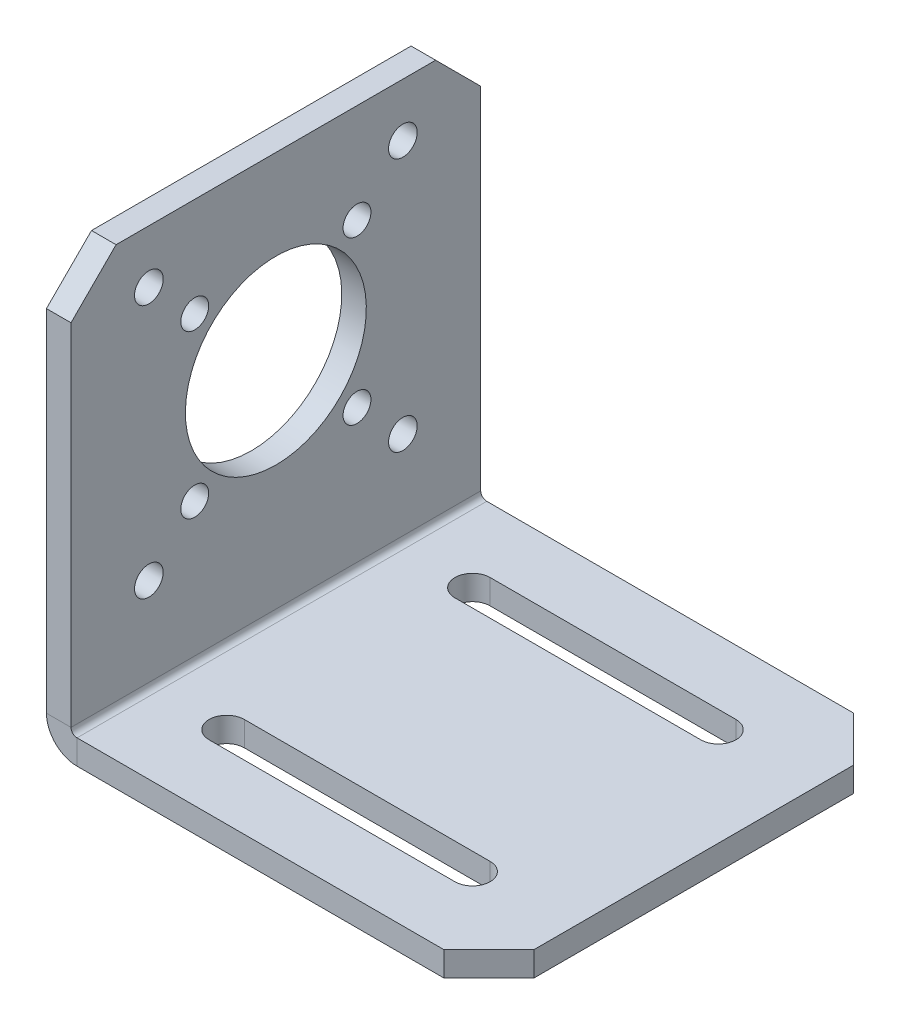
ISO-10303-21;
HEADER;
FILE_DESCRIPTION(('STEP AP214'),'2;1');
FILE_NAME('part.step','',(''),(''),'','','');
FILE_SCHEMA(('AUTOMOTIVE_DESIGN { 1 0 10303 214 1 1 1 1 }'));
ENDSEC;
DATA;
#1=APPLICATION_CONTEXT('core data for automotive mechanical design processes');
#2=APPLICATION_PROTOCOL_DEFINITION('international standard','automotive_design',2000,#1);
#3=PRODUCT_CONTEXT('',#1,'mechanical');
#4=PRODUCT('Part','Part','',(#3));
#5=PRODUCT_RELATED_PRODUCT_CATEGORY('part','',(#4));
#6=PRODUCT_DEFINITION_FORMATION('','',#4);
#7=PRODUCT_DEFINITION_CONTEXT('part definition',#1,'design');
#8=PRODUCT_DEFINITION('design','',#6,#7);
#9=PRODUCT_DEFINITION_SHAPE('','',#8);
#10=(LENGTH_UNIT() NAMED_UNIT(*) SI_UNIT(.MILLI.,.METRE.));
#11=(NAMED_UNIT(*) PLANE_ANGLE_UNIT() SI_UNIT($,.RADIAN.));
#12=(NAMED_UNIT(*) SI_UNIT($,.STERADIAN.) SOLID_ANGLE_UNIT());
#13=UNCERTAINTY_MEASURE_WITH_UNIT(LENGTH_MEASURE(1.E-05),#10,'distance_accuracy_value','');
#14=(GEOMETRIC_REPRESENTATION_CONTEXT(3) GLOBAL_UNCERTAINTY_ASSIGNED_CONTEXT((#13)) GLOBAL_UNIT_ASSIGNED_CONTEXT((#10,
#11,#12)) REPRESENTATION_CONTEXT('',''));
#15=CARTESIAN_POINT('',(0.,0.,0.));
#16=DIRECTION('',(0.,0.,1.));
#17=DIRECTION('',(1.,0.,0.));
#18=AXIS2_PLACEMENT_3D('',#15,#16,#17);
#19=CARTESIAN_POINT('',(3.7366,0.,-50.));
#20=DIRECTION('',(0.,0.,-1.));
#21=DIRECTION('',(-1.,0.,0.));
#22=AXIS2_PLACEMENT_3D('',#19,#20,#21);
#23=PLANE('',#22);
#24=DIRECTION('',(0.,1.,0.));
#25=VECTOR('',#24,1.);
#26=CARTESIAN_POINT('',(3.7366,0.,-50.));
#27=LINE('',#26,#25);
#28=CARTESIAN_POINT('',(3.7366,0.,-50.));
#29=VERTEX_POINT('',#28);
#30=CARTESIAN_POINT('',(3.7366,3.,-50.));
#31=VERTEX_POINT('',#30);
#32=EDGE_CURVE('E345',#29,#31,#27,.T.);
#33=ORIENTED_EDGE('',*,*,#32,.F.);
#34=CARTESIAN_POINT('',(3.7366,3.73660000000001,-50.));
#35=DIRECTION('',(0.,0.,-1.));
#36=DIRECTION('',(-1.,0.,0.));
#37=AXIS2_PLACEMENT_3D('',#34,#35,#36);
#38=CIRCLE('',#37,3.7366);
#39=CARTESIAN_POINT('',(0.,3.73660000000003,-50.));
#40=VERTEX_POINT('',#39);
#41=EDGE_CURVE('E291',#40,#29,#38,.F.);
#42=ORIENTED_EDGE('',*,*,#41,.F.);
#43=DIRECTION('',(-1.,0.,0.));
#44=VECTOR('',#43,1.);
#45=CARTESIAN_POINT('',(3.,3.73660000000001,-50.));
#46=LINE('',#45,#44);
#47=CARTESIAN_POINT('',(3.,3.73660000000001,-50.));
#48=VERTEX_POINT('',#47);
#49=EDGE_CURVE('E342',#48,#40,#46,.T.);
#50=ORIENTED_EDGE('',*,*,#49,.F.);
#51=CARTESIAN_POINT('',(3.7366,3.73660000000001,-50.));
#52=DIRECTION('',(0.,0.,-1.));
#53=DIRECTION('',(-1.,0.,0.));
#54=AXIS2_PLACEMENT_3D('',#51,#52,#53);
#55=CIRCLE('',#54,0.7366);
#56=EDGE_CURVE('E298',#48,#31,#55,.F.);
#57=ORIENTED_EDGE('',*,*,#56,.T.);
#58=EDGE_LOOP('',(#33,#42,#50,#57));
#59=FACE_BOUND('',#58,.T.);
#60=ADVANCED_FACE('F40',(#59),#23,.T.);
#61=CARTESIAN_POINT('',(3.,3.73660000000001,-50.));
#62=DIRECTION('',(0.,0.,-1.));
#63=DIRECTION('',(-1.,0.,0.));
#64=AXIS2_PLACEMENT_3D('',#61,#62,#63);
#65=PLANE('',#64);
#66=DIRECTION('',(1.,0.,0.));
#67=VECTOR('',#66,1.);
#68=CARTESIAN_POINT('',(0.,3.,-50.));
#69=LINE('',#68,#67);
#70=CARTESIAN_POINT('',(48.5,2.99999999999999,-50.));
#71=VERTEX_POINT('',#70);
#72=EDGE_CURVE('E286',#31,#71,#69,.T.);
#73=ORIENTED_EDGE('',*,*,#72,.T.);
#74=DIRECTION('',(0.,-1.,0.));
#75=VECTOR('',#74,1.);
#76=CARTESIAN_POINT('',(48.5,3.73660000000001,-50.));
#77=LINE('',#76,#75);
#78=CARTESIAN_POINT('',(48.5,0.,-50.));
#79=VERTEX_POINT('',#78);
#80=EDGE_CURVE('E63',#71,#79,#77,.T.);
#81=ORIENTED_EDGE('',*,*,#80,.T.);
#82=DIRECTION('',(1.,0.,0.));
#83=VECTOR('',#82,1.);
#84=CARTESIAN_POINT('',(0.,0.,-50.));
#85=LINE('',#84,#83);
#86=EDGE_CURVE('E288',#29,#79,#85,.T.);
#87=ORIENTED_EDGE('',*,*,#86,.F.);
#88=ORIENTED_EDGE('',*,*,#32,.T.);
#89=EDGE_LOOP('',(#73,#81,#87,#88));
#90=FACE_BOUND('',#89,.T.);
#91=ADVANCED_FACE('F412',(#90),#65,.T.);
#92=CARTESIAN_POINT('',(0.,3.73660000000003,0.));
#93=DIRECTION('',(0.,0.,1.));
#94=DIRECTION('',(1.,0.,0.));
#95=AXIS2_PLACEMENT_3D('',#92,#93,#94);
#96=PLANE('',#95);
#97=DIRECTION('',(1.,0.,0.));
#98=VECTOR('',#97,1.);
#99=CARTESIAN_POINT('',(0.,3.73660000000003,0.));
#100=LINE('',#99,#98);
#101=CARTESIAN_POINT('',(0.,3.73660000000003,0.));
#102=VERTEX_POINT('',#101);
#103=CARTESIAN_POINT('',(3.,3.73660000000001,0.));
#104=VERTEX_POINT('',#103);
#105=EDGE_CURVE('E339',#102,#104,#100,.T.);
#106=ORIENTED_EDGE('',*,*,#105,.F.);
#107=CARTESIAN_POINT('',(3.7366,3.73660000000001,0.));
#108=DIRECTION('',(0.,0.,-1.));
#109=DIRECTION('',(-1.,0.,0.));
#110=AXIS2_PLACEMENT_3D('',#107,#108,#109);
#111=CIRCLE('',#110,3.7366);
#112=CARTESIAN_POINT('',(3.7366,0.,0.));
#113=VERTEX_POINT('',#112);
#114=EDGE_CURVE('E306',#102,#113,#111,.F.);
#115=ORIENTED_EDGE('',*,*,#114,.T.);
#116=DIRECTION('',(0.,-1.,0.));
#117=VECTOR('',#116,1.);
#118=CARTESIAN_POINT('',(3.7366,3.,0.));
#119=LINE('',#118,#117);
#120=CARTESIAN_POINT('',(3.7366,3.,0.));
#121=VERTEX_POINT('',#120);
#122=EDGE_CURVE('E337',#121,#113,#119,.T.);
#123=ORIENTED_EDGE('',*,*,#122,.F.);
#124=CARTESIAN_POINT('',(3.7366,3.73660000000001,0.));
#125=DIRECTION('',(0.,0.,-1.));
#126=DIRECTION('',(-1.,0.,0.));
#127=AXIS2_PLACEMENT_3D('',#124,#125,#126);
#128=CIRCLE('',#127,0.7366);
#129=EDGE_CURVE('E289',#104,#121,#128,.F.);
#130=ORIENTED_EDGE('',*,*,#129,.F.);
#131=EDGE_LOOP('',(#106,#115,#123,#130));
#132=FACE_BOUND('',#131,.T.);
#133=ADVANCED_FACE('F392',(#132),#96,.T.);
#134=CARTESIAN_POINT('',(3.7366,3.,0.));
#135=DIRECTION('',(0.,0.,1.));
#136=DIRECTION('',(1.,0.,0.));
#137=AXIS2_PLACEMENT_3D('',#134,#135,#136);
#138=PLANE('',#137);
#139=DIRECTION('',(0.,-1.,0.));
#140=VECTOR('',#139,1.);
#141=CARTESIAN_POINT('',(3.,52.,0.));
#142=LINE('',#141,#140);
#143=CARTESIAN_POINT('',(3.,46.5,0.));
#144=VERTEX_POINT('',#143);
#145=EDGE_CURVE('E311',#144,#104,#142,.T.);
#146=ORIENTED_EDGE('',*,*,#145,.F.);
#147=DIRECTION('',(-1.,0.,0.));
#148=VECTOR('',#147,1.);
#149=CARTESIAN_POINT('',(3.7366,46.5,0.));
#150=LINE('',#149,#148);
#151=CARTESIAN_POINT('',(0.,46.5,0.));
#152=VERTEX_POINT('',#151);
#153=EDGE_CURVE('E11',#144,#152,#150,.T.);
#154=ORIENTED_EDGE('',*,*,#153,.T.);
#155=DIRECTION('',(0.,-1.,0.));
#156=VECTOR('',#155,1.);
#157=CARTESIAN_POINT('',(0.,52.,0.));
#158=LINE('',#157,#156);
#159=EDGE_CURVE('E309',#152,#102,#158,.T.);
#160=ORIENTED_EDGE('',*,*,#159,.T.);
#161=ORIENTED_EDGE('',*,*,#105,.T.);
#162=EDGE_LOOP('',(#146,#154,#160,#161));
#163=FACE_BOUND('',#162,.T.);
#164=ADVANCED_FACE('F449',(#163),#138,.T.);
#165=CARTESIAN_POINT('',(0.,3.,-50.));
#166=DIRECTION('',(0.,-1.,0.));
#167=DIRECTION('',(1.,0.,0.));
#168=AXIS2_PLACEMENT_3D('',#165,#166,#167);
#169=PLANE('',#168);
#170=DIRECTION('',(1.,0.,0.));
#171=VECTOR('',#170,1.);
#172=CARTESIAN_POINT('',(12.,3.,-37.85));
#173=LINE('',#172,#171);
#174=CARTESIAN_POINT('',(12.,3.,-37.85));
#175=VERTEX_POINT('',#174);
#176=CARTESIAN_POINT('',(42.,2.99999999999999,-37.85));
#177=VERTEX_POINT('',#176);
#178=EDGE_CURVE('E208',#175,#177,#173,.T.);
#179=ORIENTED_EDGE('',*,*,#178,.F.);
#180=CARTESIAN_POINT('',(12.,3.,-40.));
#181=DIRECTION('',(0.,1.,0.));
#182=DIRECTION('',(-1.,0.,0.));
#183=AXIS2_PLACEMENT_3D('',#180,#181,#182);
#184=CIRCLE('',#183,2.14999999999999);
#185=CARTESIAN_POINT('',(12.,3.,-42.15));
#186=VERTEX_POINT('',#185);
#187=EDGE_CURVE('E200',#186,#175,#184,.T.);
#188=ORIENTED_EDGE('',*,*,#187,.F.);
#189=DIRECTION('',(-1.,0.,0.));
#190=VECTOR('',#189,1.);
#191=CARTESIAN_POINT('',(12.,3.,-42.15));
#192=LINE('',#191,#190);
#193=CARTESIAN_POINT('',(42.,2.99999999999999,-42.15));
#194=VERTEX_POINT('',#193);
#195=EDGE_CURVE('E201',#194,#186,#192,.T.);
#196=ORIENTED_EDGE('',*,*,#195,.F.);
#197=CARTESIAN_POINT('',(42.,2.99999999999999,-40.));
#198=DIRECTION('',(0.,1.,0.));
#199=DIRECTION('',(-1.,0.,0.));
#200=AXIS2_PLACEMENT_3D('',#197,#198,#199);
#201=CIRCLE('',#200,2.14999999999999);
#202=EDGE_CURVE('E215',#177,#194,#201,.T.);
#203=ORIENTED_EDGE('',*,*,#202,.F.);
#204=EDGE_LOOP('',(#179,#188,#196,#203));
#205=FACE_BOUND('',#204,.T.);
#206=DIRECTION('',(-1.,0.,0.));
#207=VECTOR('',#206,1.);
#208=CARTESIAN_POINT('',(42.,2.99999999999999,-12.15));
#209=LINE('',#208,#207);
#210=CARTESIAN_POINT('',(42.,2.99999999999999,-12.15));
#211=VERTEX_POINT('',#210);
#212=CARTESIAN_POINT('',(12.,3.,-12.15));
#213=VERTEX_POINT('',#212);
#214=EDGE_CURVE('E234',#211,#213,#209,.T.);
#215=ORIENTED_EDGE('',*,*,#214,.F.);
#216=CARTESIAN_POINT('',(42.,2.99999999999999,-10.));
#217=DIRECTION('',(0.,1.,0.));
#218=DIRECTION('',(-1.,0.,0.));
#219=AXIS2_PLACEMENT_3D('',#216,#217,#218);
#220=CIRCLE('',#219,2.15000000000001);
#221=CARTESIAN_POINT('',(42.,2.99999999999999,-7.85));
#222=VERTEX_POINT('',#221);
#223=EDGE_CURVE('E232',#222,#211,#220,.T.);
#224=ORIENTED_EDGE('',*,*,#223,.F.);
#225=DIRECTION('',(1.,0.,0.));
#226=VECTOR('',#225,1.);
#227=CARTESIAN_POINT('',(42.,2.99999999999999,-7.85));
#228=LINE('',#227,#226);
#229=CARTESIAN_POINT('',(12.,3.,-7.85));
#230=VERTEX_POINT('',#229);
#231=EDGE_CURVE('E240',#230,#222,#228,.T.);
#232=ORIENTED_EDGE('',*,*,#231,.F.);
#233=CARTESIAN_POINT('',(12.,3.,-10.));
#234=DIRECTION('',(0.,1.,0.));
#235=DIRECTION('',(-1.,0.,0.));
#236=AXIS2_PLACEMENT_3D('',#233,#234,#235);
#237=CIRCLE('',#236,2.15000000000001);
#238=EDGE_CURVE('E237',#213,#230,#237,.T.);
#239=ORIENTED_EDGE('',*,*,#238,.F.);
#240=EDGE_LOOP('',(#215,#224,#232,#239));
#241=FACE_BOUND('',#240,.T.);
#242=DIRECTION('',(0.,0.,1.));
#243=VECTOR('',#242,1.);
#244=CARTESIAN_POINT('',(54.,2.99999999999999,-50.));
#245=LINE('',#244,#243);
#246=CARTESIAN_POINT('',(54.,2.99999999999999,-44.5));
#247=VERTEX_POINT('',#246);
#248=CARTESIAN_POINT('',(54.,2.99999999999999,-5.50000000000003));
#249=VERTEX_POINT('',#248);
#250=EDGE_CURVE('E334',#247,#249,#245,.T.);
#251=ORIENTED_EDGE('',*,*,#250,.F.);
#252=DIRECTION('',(0.707106781186548,0.,0.707106781186548));
#253=VECTOR('',#252,1.);
#254=CARTESIAN_POINT('',(54.,2.99999999999999,-44.5));
#255=LINE('',#254,#253);
#256=EDGE_CURVE('E369',#247,#71,#255,.F.);
#257=ORIENTED_EDGE('',*,*,#256,.T.);
#258=ORIENTED_EDGE('',*,*,#72,.F.);
#259=DIRECTION('',(0.,0.,1.));
#260=VECTOR('',#259,1.);
#261=CARTESIAN_POINT('',(3.7366,3.,-50.));
#262=LINE('',#261,#260);
#263=EDGE_CURVE('E301',#31,#121,#262,.T.);
#264=ORIENTED_EDGE('',*,*,#263,.T.);
#265=DIRECTION('',(1.,0.,0.));
#266=VECTOR('',#265,1.);
#267=CARTESIAN_POINT('',(0.,3.,0.));
#268=LINE('',#267,#266);
#269=CARTESIAN_POINT('',(48.5,2.99999999999999,0.));
#270=VERTEX_POINT('',#269);
#271=EDGE_CURVE('E285',#121,#270,#268,.T.);
#272=ORIENTED_EDGE('',*,*,#271,.T.);
#273=DIRECTION('',(0.707106781186548,0.,-0.707106781186548));
#274=VECTOR('',#273,1.);
#275=CARTESIAN_POINT('',(48.5,2.99999999999999,0.));
#276=LINE('',#275,#274);
#277=EDGE_CURVE('E367',#270,#249,#276,.T.);
#278=ORIENTED_EDGE('',*,*,#277,.T.);
#279=EDGE_LOOP('',(#251,#257,#258,#264,#272,#278));
#280=FACE_BOUND('',#279,.T.);
#281=ADVANCED_FACE('F382',(#205,#241,#280),#169,.F.);
#282=CARTESIAN_POINT('',(54.,0.,-50.));
#283=DIRECTION('',(1.,0.,0.));
#284=DIRECTION('',(0.,0.,-1.));
#285=AXIS2_PLACEMENT_3D('',#282,#283,#284);
#286=PLANE('',#285);
#287=DIRECTION('',(0.,0.,1.));
#288=VECTOR('',#287,1.);
#289=CARTESIAN_POINT('',(54.,0.,-50.));
#290=LINE('',#289,#288);
#291=CARTESIAN_POINT('',(54.,0.,-44.5));
#292=VERTEX_POINT('',#291);
#293=CARTESIAN_POINT('',(54.,0.,-5.50000000000003));
#294=VERTEX_POINT('',#293);
#295=EDGE_CURVE('E332',#292,#294,#290,.T.);
#296=ORIENTED_EDGE('',*,*,#295,.F.);
#297=DIRECTION('',(0.,1.,0.));
#298=VECTOR('',#297,1.);
#299=CARTESIAN_POINT('',(54.,0.,-44.5));
#300=LINE('',#299,#298);
#301=EDGE_CURVE('E364',#292,#247,#300,.T.);
#302=ORIENTED_EDGE('',*,*,#301,.T.);
#303=ORIENTED_EDGE('',*,*,#250,.T.);
#304=DIRECTION('',(0.,-1.,0.));
#305=VECTOR('',#304,1.);
#306=CARTESIAN_POINT('',(54.,0.,-5.50000000000003));
#307=LINE('',#306,#305);
#308=EDGE_CURVE('E362',#249,#294,#307,.T.);
#309=ORIENTED_EDGE('',*,*,#308,.T.);
#310=EDGE_LOOP('',(#296,#302,#303,#309));
#311=FACE_BOUND('',#310,.T.);
#312=ADVANCED_FACE('F401',(#311),#286,.T.);
#313=CARTESIAN_POINT('',(0.,0.,-50.));
#314=DIRECTION('',(0.,-1.,0.));
#315=DIRECTION('',(1.,0.,0.));
#316=AXIS2_PLACEMENT_3D('',#313,#314,#315);
#317=PLANE('',#316);
#318=CARTESIAN_POINT('',(12.,0.,-40.));
#319=DIRECTION('',(0.,-1.,0.));
#320=DIRECTION('',(1.,0.,0.));
#321=AXIS2_PLACEMENT_3D('',#318,#319,#320);
#322=CIRCLE('',#321,2.14999999999999);
#323=CARTESIAN_POINT('',(12.,0.,-42.15));
#324=VERTEX_POINT('',#323);
#325=CARTESIAN_POINT('',(12.,0.,-37.85));
#326=VERTEX_POINT('',#325);
#327=EDGE_CURVE('E197',#324,#326,#322,.F.);
#328=ORIENTED_EDGE('',*,*,#327,.T.);
#329=DIRECTION('',(1.,0.,0.));
#330=VECTOR('',#329,1.);
#331=CARTESIAN_POINT('',(12.,0.,-37.85));
#332=LINE('',#331,#330);
#333=CARTESIAN_POINT('',(42.,0.,-37.85));
#334=VERTEX_POINT('',#333);
#335=EDGE_CURVE('E181',#326,#334,#332,.T.);
#336=ORIENTED_EDGE('',*,*,#335,.T.);
#337=CARTESIAN_POINT('',(42.,0.,-40.));
#338=DIRECTION('',(0.,-1.,0.));
#339=DIRECTION('',(1.,0.,0.));
#340=AXIS2_PLACEMENT_3D('',#337,#338,#339);
#341=CIRCLE('',#340,2.14999999999999);
#342=CARTESIAN_POINT('',(42.,0.,-42.15));
#343=VERTEX_POINT('',#342);
#344=EDGE_CURVE('E210',#334,#343,#341,.F.);
#345=ORIENTED_EDGE('',*,*,#344,.T.);
#346=DIRECTION('',(-1.,0.,0.));
#347=VECTOR('',#346,1.);
#348=CARTESIAN_POINT('',(12.,0.,-42.15));
#349=LINE('',#348,#347);
#350=EDGE_CURVE('E206',#343,#324,#349,.T.);
#351=ORIENTED_EDGE('',*,*,#350,.T.);
#352=EDGE_LOOP('',(#328,#336,#345,#351));
#353=FACE_BOUND('',#352,.T.);
#354=CARTESIAN_POINT('',(42.,0.,-10.));
#355=DIRECTION('',(0.,-1.,0.));
#356=DIRECTION('',(1.,0.,0.));
#357=AXIS2_PLACEMENT_3D('',#354,#355,#356);
#358=CIRCLE('',#357,2.15000000000001);
#359=CARTESIAN_POINT('',(42.,0.,-7.85));
#360=VERTEX_POINT('',#359);
#361=CARTESIAN_POINT('',(42.,0.,-12.15));
#362=VERTEX_POINT('',#361);
#363=EDGE_CURVE('E229',#360,#362,#358,.F.);
#364=ORIENTED_EDGE('',*,*,#363,.T.);
#365=DIRECTION('',(-1.,0.,0.));
#366=VECTOR('',#365,1.);
#367=CARTESIAN_POINT('',(42.,0.,-12.15));
#368=LINE('',#367,#366);
#369=CARTESIAN_POINT('',(12.,0.,-12.15));
#370=VERTEX_POINT('',#369);
#371=EDGE_CURVE('E246',#362,#370,#368,.T.);
#372=ORIENTED_EDGE('',*,*,#371,.T.);
#373=CARTESIAN_POINT('',(12.,0.,-10.));
#374=DIRECTION('',(0.,-1.,0.));
#375=DIRECTION('',(1.,0.,0.));
#376=AXIS2_PLACEMENT_3D('',#373,#374,#375);
#377=CIRCLE('',#376,2.15000000000001);
#378=CARTESIAN_POINT('',(12.,0.,-7.85));
#379=VERTEX_POINT('',#378);
#380=EDGE_CURVE('E192',#370,#379,#377,.F.);
#381=ORIENTED_EDGE('',*,*,#380,.T.);
#382=DIRECTION('',(1.,0.,0.));
#383=VECTOR('',#382,1.);
#384=CARTESIAN_POINT('',(42.,0.,-7.85));
#385=LINE('',#384,#383);
#386=EDGE_CURVE('E226',#379,#360,#385,.T.);
#387=ORIENTED_EDGE('',*,*,#386,.T.);
#388=EDGE_LOOP('',(#364,#372,#381,#387));
#389=FACE_BOUND('',#388,.T.);
#390=ORIENTED_EDGE('',*,*,#86,.T.);
#391=DIRECTION('',(-0.707106781186548,0.,-0.707106781186548));
#392=VECTOR('',#391,1.);
#393=CARTESIAN_POINT('',(24.25,0.,-74.25));
#394=LINE('',#393,#392);
#395=EDGE_CURVE('E373',#79,#292,#394,.F.);
#396=ORIENTED_EDGE('',*,*,#395,.T.);
#397=ORIENTED_EDGE('',*,*,#295,.T.);
#398=DIRECTION('',(-0.707106781186548,0.,0.707106781186548));
#399=VECTOR('',#398,1.);
#400=CARTESIAN_POINT('',(49.25,0.,-0.750000000000028));
#401=LINE('',#400,#399);
#402=CARTESIAN_POINT('',(48.5,0.,0.));
#403=VERTEX_POINT('',#402);
#404=EDGE_CURVE('E55',#294,#403,#401,.T.);
#405=ORIENTED_EDGE('',*,*,#404,.T.);
#406=DIRECTION('',(1.,0.,0.));
#407=VECTOR('',#406,1.);
#408=CARTESIAN_POINT('',(0.,0.,0.));
#409=LINE('',#408,#407);
#410=EDGE_CURVE('E304',#113,#403,#409,.T.);
#411=ORIENTED_EDGE('',*,*,#410,.F.);
#412=DIRECTION('',(0.,0.,1.));
#413=VECTOR('',#412,1.);
#414=CARTESIAN_POINT('',(3.7366,0.,-50.));
#415=LINE('',#414,#413);
#416=EDGE_CURVE('E329',#29,#113,#415,.T.);
#417=ORIENTED_EDGE('',*,*,#416,.F.);
#418=EDGE_LOOP('',(#390,#396,#397,#405,#411,#417));
#419=FACE_BOUND('',#418,.T.);
#420=ADVANCED_FACE('F204',(#353,#389,#419),#317,.T.);
#421=CARTESIAN_POINT('',(3.7366,3.73660000000001,-50.));
#422=DIRECTION('',(0.,0.,1.));
#423=DIRECTION('',(1.,0.,0.));
#424=AXIS2_PLACEMENT_3D('',#421,#422,#423);
#425=CYLINDRICAL_SURFACE('',#424,3.7366);
#426=ORIENTED_EDGE('',*,*,#114,.F.);
#427=DIRECTION('',(0.,0.,1.));
#428=VECTOR('',#427,1.);
#429=CARTESIAN_POINT('',(0.,3.73660000000003,-50.));
#430=LINE('',#429,#428);
#431=EDGE_CURVE('E326',#40,#102,#430,.T.);
#432=ORIENTED_EDGE('',*,*,#431,.F.);
#433=ORIENTED_EDGE('',*,*,#41,.T.);
#434=ORIENTED_EDGE('',*,*,#416,.T.);
#435=EDGE_LOOP('',(#426,#432,#433,#434));
#436=FACE_BOUND('',#435,.T.);
#437=ADVANCED_FACE('F396',(#436),#425,.T.);
#438=CARTESIAN_POINT('',(0.,52.,-50.));
#439=DIRECTION('',(-1.,0.,0.));
#440=DIRECTION('',(0.,-1.,0.));
#441=AXIS2_PLACEMENT_3D('',#438,#439,#440);
#442=PLANE('',#441);
#443=CARTESIAN_POINT('',(0.,20.1005050633885,-15.1005050633882));
#444=DIRECTION('',(-1.,0.,0.));
#445=DIRECTION('',(0.,0.,1.));
#446=AXIS2_PLACEMENT_3D('',#443,#444,#445);
#447=CIRCLE('',#446,1.7);
#448=CARTESIAN_POINT('',(0.,20.1005050633885,-13.4005050633882));
#449=VERTEX_POINT('',#448);
#450=EDGE_CURVE('E544',#449,#449,#447,.T.);
#451=ORIENTED_EDGE('',*,*,#450,.F.);
#452=EDGE_LOOP('',(#451));
#453=FACE_BOUND('',#452,.T.);
#454=CARTESIAN_POINT('',(0.,20.1005050633883,-34.8994949366116));
#455=DIRECTION('',(-1.,0.,0.));
#456=DIRECTION('',(0.,0.,1.));
#457=AXIS2_PLACEMENT_3D('',#454,#455,#456);
#458=CIRCLE('',#457,1.7);
#459=CARTESIAN_POINT('',(0.,20.1005050633883,-33.1994949366116));
#460=VERTEX_POINT('',#459);
#461=EDGE_CURVE('E548',#460,#460,#458,.T.);
#462=ORIENTED_EDGE('',*,*,#461,.F.);
#463=EDGE_LOOP('',(#462));
#464=FACE_BOUND('',#463,.T.);
#465=CARTESIAN_POINT('',(0.,39.8994949366116,-34.8994949366117));
#466=DIRECTION('',(-1.,0.,0.));
#467=DIRECTION('',(0.,0.,1.));
#468=AXIS2_PLACEMENT_3D('',#465,#466,#467);
#469=CIRCLE('',#468,1.7);
#470=CARTESIAN_POINT('',(0.,39.8994949366116,-33.1994949366117));
#471=VERTEX_POINT('',#470);
#472=EDGE_CURVE('E557',#471,#471,#469,.T.);
#473=ORIENTED_EDGE('',*,*,#472,.F.);
#474=EDGE_LOOP('',(#473));
#475=FACE_BOUND('',#474,.T.);
#476=CARTESIAN_POINT('',(0.,39.8994949366117,-15.1005050633884));
#477=DIRECTION('',(-1.,0.,0.));
#478=DIRECTION('',(0.,0.,1.));
#479=AXIS2_PLACEMENT_3D('',#476,#477,#478);
#480=CIRCLE('',#479,1.7);
#481=CARTESIAN_POINT('',(0.,39.8994949366117,-13.4005050633884));
#482=VERTEX_POINT('',#481);
#483=EDGE_CURVE('E563',#482,#482,#480,.T.);
#484=ORIENTED_EDGE('',*,*,#483,.F.);
#485=EDGE_LOOP('',(#484));
#486=FACE_BOUND('',#485,.T.);
#487=CARTESIAN_POINT('',(0.,14.5,-9.50000000000001));
#488=DIRECTION('',(-1.,0.,0.));
#489=DIRECTION('',(0.,-1.,0.));
#490=AXIS2_PLACEMENT_3D('',#487,#488,#489);
#491=CIRCLE('',#490,1.75);
#492=CARTESIAN_POINT('',(0.,12.75,-9.50000000000001));
#493=VERTEX_POINT('',#492);
#494=EDGE_CURVE('E256',#493,#493,#491,.T.);
#495=ORIENTED_EDGE('',*,*,#494,.F.);
#496=EDGE_LOOP('',(#495));
#497=FACE_BOUND('',#496,.T.);
#498=CARTESIAN_POINT('',(0.,14.5,-40.5));
#499=DIRECTION('',(-1.,0.,0.));
#500=DIRECTION('',(0.,-1.,0.));
#501=AXIS2_PLACEMENT_3D('',#498,#499,#500);
#502=CIRCLE('',#501,1.75000000000001);
#503=CARTESIAN_POINT('',(0.,12.75,-40.5));
#504=VERTEX_POINT('',#503);
#505=EDGE_CURVE('E264',#504,#504,#502,.T.);
#506=ORIENTED_EDGE('',*,*,#505,.F.);
#507=EDGE_LOOP('',(#506));
#508=FACE_BOUND('',#507,.T.);
#509=CARTESIAN_POINT('',(0.,30.,-25.));
#510=DIRECTION('',(-1.,0.,0.));
#511=DIRECTION('',(0.,-1.,0.));
#512=AXIS2_PLACEMENT_3D('',#509,#510,#511);
#513=CIRCLE('',#512,11.04);
#514=CARTESIAN_POINT('',(0.,18.96,-25.));
#515=VERTEX_POINT('',#514);
#516=EDGE_CURVE('E270',#515,#515,#513,.T.);
#517=ORIENTED_EDGE('',*,*,#516,.F.);
#518=EDGE_LOOP('',(#517));
#519=FACE_BOUND('',#518,.T.);
#520=CARTESIAN_POINT('',(0.,45.5,-40.5));
#521=DIRECTION('',(-1.,0.,0.));
#522=DIRECTION('',(0.,-1.,0.));
#523=AXIS2_PLACEMENT_3D('',#520,#521,#522);
#524=CIRCLE('',#523,1.75);
#525=CARTESIAN_POINT('',(0.,43.75,-40.5));
#526=VERTEX_POINT('',#525);
#527=EDGE_CURVE('E255',#526,#526,#524,.T.);
#528=ORIENTED_EDGE('',*,*,#527,.F.);
#529=EDGE_LOOP('',(#528));
#530=FACE_BOUND('',#529,.T.);
#531=CARTESIAN_POINT('',(0.,45.5,-9.50000000000001));
#532=DIRECTION('',(-1.,0.,0.));
#533=DIRECTION('',(0.,-1.,0.));
#534=AXIS2_PLACEMENT_3D('',#531,#532,#533);
#535=CIRCLE('',#534,1.75000000000001);
#536=CARTESIAN_POINT('',(0.,43.75,-9.50000000000001));
#537=VERTEX_POINT('',#536);
#538=EDGE_CURVE('E263',#537,#537,#535,.T.);
#539=ORIENTED_EDGE('',*,*,#538,.F.);
#540=EDGE_LOOP('',(#539));
#541=FACE_BOUND('',#540,.T.);
#542=DIRECTION('',(0.,0.,1.));
#543=VECTOR('',#542,1.);
#544=CARTESIAN_POINT('',(0.,52.,-50.));
#545=LINE('',#544,#543);
#546=CARTESIAN_POINT('',(0.,52.,-44.5));
#547=VERTEX_POINT('',#546);
#548=CARTESIAN_POINT('',(0.,52.,-5.50000000000003));
#549=VERTEX_POINT('',#548);
#550=EDGE_CURVE('E323',#547,#549,#545,.T.);
#551=ORIENTED_EDGE('',*,*,#550,.F.);
#552=DIRECTION('',(0.,0.707106781186548,0.707106781186548));
#553=VECTOR('',#552,1.);
#554=CARTESIAN_POINT('',(0.,49.25,-47.25));
#555=LINE('',#554,#553);
#556=CARTESIAN_POINT('',(0.,46.5,-50.));
#557=VERTEX_POINT('',#556);
#558=EDGE_CURVE('E354',#547,#557,#555,.F.);
#559=ORIENTED_EDGE('',*,*,#558,.T.);
#560=DIRECTION('',(0.,-1.,0.));
#561=VECTOR('',#560,1.);
#562=CARTESIAN_POINT('',(0.,52.,-50.));
#563=LINE('',#562,#561);
#564=EDGE_CURVE('E294',#557,#40,#563,.T.);
#565=ORIENTED_EDGE('',*,*,#564,.T.);
#566=ORIENTED_EDGE('',*,*,#431,.T.);
#567=ORIENTED_EDGE('',*,*,#159,.F.);
#568=DIRECTION('',(0.,-0.707106781186548,0.707106781186548));
#569=VECTOR('',#568,1.);
#570=CARTESIAN_POINT('',(0.,74.25,-27.75));
#571=LINE('',#570,#569);
#572=EDGE_CURVE('E352',#152,#549,#571,.F.);
#573=ORIENTED_EDGE('',*,*,#572,.T.);
#574=EDGE_LOOP('',(#551,#559,#565,#566,#567,#573));
#575=FACE_BOUND('',#574,.T.);
#576=ADVANCED_FACE('F407',(#453,#464,#475,#486,#497,#508,#519,#530,#541,#575),#442,.T.);
#577=CARTESIAN_POINT('',(3.,52.,-50.));
#578=DIRECTION('',(0.,1.,0.));
#579=DIRECTION('',(0.,0.,1.));
#580=AXIS2_PLACEMENT_3D('',#577,#578,#579);
#581=PLANE('',#580);
#582=DIRECTION('',(0.,0.,1.));
#583=VECTOR('',#582,1.);
#584=CARTESIAN_POINT('',(3.,52.,-50.));
#585=LINE('',#584,#583);
#586=CARTESIAN_POINT('',(3.,52.,-44.5));
#587=VERTEX_POINT('',#586);
#588=CARTESIAN_POINT('',(3.,52.,-5.50000000000003));
#589=VERTEX_POINT('',#588);
#590=EDGE_CURVE('E320',#587,#589,#585,.T.);
#591=ORIENTED_EDGE('',*,*,#590,.F.);
#592=DIRECTION('',(-1.,0.,0.));
#593=VECTOR('',#592,1.);
#594=CARTESIAN_POINT('',(3.,52.,-44.5));
#595=LINE('',#594,#593);
#596=EDGE_CURVE('E349',#587,#547,#595,.T.);
#597=ORIENTED_EDGE('',*,*,#596,.T.);
#598=ORIENTED_EDGE('',*,*,#550,.T.);
#599=DIRECTION('',(1.,0.,0.));
#600=VECTOR('',#599,1.);
#601=CARTESIAN_POINT('',(3.,52.,-5.50000000000003));
#602=LINE('',#601,#600);
#603=EDGE_CURVE('E347',#549,#589,#602,.T.);
#604=ORIENTED_EDGE('',*,*,#603,.T.);
#605=EDGE_LOOP('',(#591,#597,#598,#604));
#606=FACE_BOUND('',#605,.T.);
#607=ADVANCED_FACE('F458',(#606),#581,.T.);
#608=CARTESIAN_POINT('',(3.,52.,-50.));
#609=DIRECTION('',(-1.,0.,0.));
#610=DIRECTION('',(0.,-1.,0.));
#611=AXIS2_PLACEMENT_3D('',#608,#609,#610);
#612=PLANE('',#611);
#613=CARTESIAN_POINT('',(3.,20.1005050633885,-15.1005050633882));
#614=DIRECTION('',(-1.,0.,0.));
#615=DIRECTION('',(0.,-1.,0.));
#616=AXIS2_PLACEMENT_3D('',#613,#614,#615);
#617=CIRCLE('',#616,1.7);
#618=CARTESIAN_POINT('',(3.,18.4005050633885,-15.1005050633882));
#619=VERTEX_POINT('',#618);
#620=EDGE_CURVE('E547',#619,#619,#617,.T.);
#621=ORIENTED_EDGE('',*,*,#620,.T.);
#622=EDGE_LOOP('',(#621));
#623=FACE_BOUND('',#622,.T.);
#624=CARTESIAN_POINT('',(3.,20.1005050633883,-34.8994949366116));
#625=DIRECTION('',(-1.,0.,0.));
#626=DIRECTION('',(0.,-1.,0.));
#627=AXIS2_PLACEMENT_3D('',#624,#625,#626);
#628=CIRCLE('',#627,1.7);
#629=CARTESIAN_POINT('',(3.,18.4005050633883,-34.8994949366116));
#630=VERTEX_POINT('',#629);
#631=EDGE_CURVE('E551',#630,#630,#628,.T.);
#632=ORIENTED_EDGE('',*,*,#631,.T.);
#633=EDGE_LOOP('',(#632));
#634=FACE_BOUND('',#633,.T.);
#635=CARTESIAN_POINT('',(3.,39.8994949366116,-34.8994949366117));
#636=DIRECTION('',(-1.,0.,0.));
#637=DIRECTION('',(0.,-1.,0.));
#638=AXIS2_PLACEMENT_3D('',#635,#636,#637);
#639=CIRCLE('',#638,1.7);
#640=CARTESIAN_POINT('',(3.,38.1994949366116,-34.8994949366117));
#641=VERTEX_POINT('',#640);
#642=EDGE_CURVE('E560',#641,#641,#639,.T.);
#643=ORIENTED_EDGE('',*,*,#642,.T.);
#644=EDGE_LOOP('',(#643));
#645=FACE_BOUND('',#644,.T.);
#646=CARTESIAN_POINT('',(3.,39.8994949366117,-15.1005050633884));
#647=DIRECTION('',(-1.,0.,0.));
#648=DIRECTION('',(0.,-1.,0.));
#649=AXIS2_PLACEMENT_3D('',#646,#647,#648);
#650=CIRCLE('',#649,1.7);
#651=CARTESIAN_POINT('',(3.,38.1994949366117,-15.1005050633884));
#652=VERTEX_POINT('',#651);
#653=EDGE_CURVE('E566',#652,#652,#650,.T.);
#654=ORIENTED_EDGE('',*,*,#653,.T.);
#655=EDGE_LOOP('',(#654));
#656=FACE_BOUND('',#655,.T.);
#657=CARTESIAN_POINT('',(3.,14.5,-9.50000000000001));
#658=DIRECTION('',(-1.,0.,0.));
#659=DIRECTION('',(0.,-1.,0.));
#660=AXIS2_PLACEMENT_3D('',#657,#658,#659);
#661=CIRCLE('',#660,1.75);
#662=CARTESIAN_POINT('',(3.,12.75,-9.50000000000001));
#663=VERTEX_POINT('',#662);
#664=EDGE_CURVE('E259',#663,#663,#661,.F.);
#665=ORIENTED_EDGE('',*,*,#664,.F.);
#666=EDGE_LOOP('',(#665));
#667=FACE_BOUND('',#666,.T.);
#668=CARTESIAN_POINT('',(3.,14.5,-40.5));
#669=DIRECTION('',(-1.,0.,0.));
#670=DIRECTION('',(0.,-1.,0.));
#671=AXIS2_PLACEMENT_3D('',#668,#669,#670);
#672=CIRCLE('',#671,1.75000000000001);
#673=CARTESIAN_POINT('',(3.,12.75,-40.5));
#674=VERTEX_POINT('',#673);
#675=EDGE_CURVE('E260',#674,#674,#672,.F.);
#676=ORIENTED_EDGE('',*,*,#675,.F.);
#677=EDGE_LOOP('',(#676));
#678=FACE_BOUND('',#677,.T.);
#679=CARTESIAN_POINT('',(3.,30.,-25.));
#680=DIRECTION('',(-1.,0.,0.));
#681=DIRECTION('',(0.,-1.,0.));
#682=AXIS2_PLACEMENT_3D('',#679,#680,#681);
#683=CIRCLE('',#682,11.04);
#684=CARTESIAN_POINT('',(3.,18.96,-25.));
#685=VERTEX_POINT('',#684);
#686=EDGE_CURVE('E267',#685,#685,#683,.F.);
#687=ORIENTED_EDGE('',*,*,#686,.F.);
#688=EDGE_LOOP('',(#687));
#689=FACE_BOUND('',#688,.T.);
#690=CARTESIAN_POINT('',(3.,45.5,-40.5));
#691=DIRECTION('',(-1.,0.,0.));
#692=DIRECTION('',(0.,-1.,0.));
#693=AXIS2_PLACEMENT_3D('',#690,#691,#692);
#694=CIRCLE('',#693,1.75);
#695=CARTESIAN_POINT('',(3.,43.75,-40.5));
#696=VERTEX_POINT('',#695);
#697=EDGE_CURVE('E273',#696,#696,#694,.F.);
#698=ORIENTED_EDGE('',*,*,#697,.F.);
#699=EDGE_LOOP('',(#698));
#700=FACE_BOUND('',#699,.T.);
#701=CARTESIAN_POINT('',(3.,45.5,-9.50000000000001));
#702=DIRECTION('',(-1.,0.,0.));
#703=DIRECTION('',(0.,-1.,0.));
#704=AXIS2_PLACEMENT_3D('',#701,#702,#703);
#705=CIRCLE('',#704,1.75000000000001);
#706=CARTESIAN_POINT('',(3.,43.75,-9.50000000000001));
#707=VERTEX_POINT('',#706);
#708=EDGE_CURVE('E282',#707,#707,#705,.F.);
#709=ORIENTED_EDGE('',*,*,#708,.F.);
#710=EDGE_LOOP('',(#709));
#711=FACE_BOUND('',#710,.T.);
#712=DIRECTION('',(0.,-1.,0.));
#713=VECTOR('',#712,1.);
#714=CARTESIAN_POINT('',(3.,52.,-50.));
#715=LINE('',#714,#713);
#716=CARTESIAN_POINT('',(3.,46.5,-50.));
#717=VERTEX_POINT('',#716);
#718=EDGE_CURVE('E296',#717,#48,#715,.T.);
#719=ORIENTED_EDGE('',*,*,#718,.F.);
#720=DIRECTION('',(0.,-0.707106781186548,-0.707106781186548));
#721=VECTOR('',#720,1.);
#722=CARTESIAN_POINT('',(3.,52.,-44.5));
#723=LINE('',#722,#721);
#724=EDGE_CURVE('E360',#717,#587,#723,.F.);
#725=ORIENTED_EDGE('',*,*,#724,.T.);
#726=ORIENTED_EDGE('',*,*,#590,.T.);
#727=DIRECTION('',(0.,0.707106781186548,-0.707106781186548));
#728=VECTOR('',#727,1.);
#729=CARTESIAN_POINT('',(3.,46.5,0.));
#730=LINE('',#729,#728);
#731=EDGE_CURVE('E358',#589,#144,#730,.F.);
#732=ORIENTED_EDGE('',*,*,#731,.T.);
#733=ORIENTED_EDGE('',*,*,#145,.T.);
#734=DIRECTION('',(0.,0.,1.));
#735=VECTOR('',#734,1.);
#736=CARTESIAN_POINT('',(3.,3.73660000000001,-50.));
#737=LINE('',#736,#735);
#738=EDGE_CURVE('E317',#48,#104,#737,.T.);
#739=ORIENTED_EDGE('',*,*,#738,.F.);
#740=EDGE_LOOP('',(#719,#725,#726,#732,#733,#739));
#741=FACE_BOUND('',#740,.T.);
#742=ADVANCED_FACE('F443',(#623,#634,#645,#656,#667,#678,#689,#700,#711,#741),#612,.F.);
#743=CARTESIAN_POINT('',(3.7366,3.73660000000001,-50.));
#744=DIRECTION('',(0.,0.,1.));
#745=DIRECTION('',(1.,0.,0.));
#746=AXIS2_PLACEMENT_3D('',#743,#744,#745);
#747=CYLINDRICAL_SURFACE('',#746,0.7366);
#748=ORIENTED_EDGE('',*,*,#129,.T.);
#749=ORIENTED_EDGE('',*,*,#263,.F.);
#750=ORIENTED_EDGE('',*,*,#56,.F.);
#751=ORIENTED_EDGE('',*,*,#738,.T.);
#752=EDGE_LOOP('',(#748,#749,#750,#751));
#753=FACE_BOUND('',#752,.T.);
#754=ADVANCED_FACE('F387',(#753),#747,.F.);
#755=CARTESIAN_POINT('',(3.7366,3.73660000000001,-50.));
#756=DIRECTION('',(0.,0.,-1.));
#757=DIRECTION('',(-1.,0.,0.));
#758=AXIS2_PLACEMENT_3D('',#755,#756,#757);
#759=PLANE('',#758);
#760=ORIENTED_EDGE('',*,*,#564,.F.);
#761=DIRECTION('',(1.,0.,0.));
#762=VECTOR('',#761,1.);
#763=CARTESIAN_POINT('',(3.7366,46.5,-50.));
#764=LINE('',#763,#762);
#765=EDGE_CURVE('E356',#557,#717,#764,.T.);
#766=ORIENTED_EDGE('',*,*,#765,.T.);
#767=ORIENTED_EDGE('',*,*,#718,.T.);
#768=ORIENTED_EDGE('',*,*,#49,.T.);
#769=EDGE_LOOP('',(#760,#766,#767,#768));
#770=FACE_BOUND('',#769,.T.);
#771=ADVANCED_FACE('F454',(#770),#759,.T.);
#772=CARTESIAN_POINT('',(3.7366,3.73660000000001,0.));
#773=DIRECTION('',(0.,0.,-1.));
#774=DIRECTION('',(-1.,0.,0.));
#775=AXIS2_PLACEMENT_3D('',#772,#773,#774);
#776=PLANE('',#775);
#777=ORIENTED_EDGE('',*,*,#410,.T.);
#778=DIRECTION('',(0.,1.,0.));
#779=VECTOR('',#778,1.);
#780=CARTESIAN_POINT('',(48.5,2.99999999999999,0.));
#781=LINE('',#780,#779);
#782=EDGE_CURVE('E48',#403,#270,#781,.T.);
#783=ORIENTED_EDGE('',*,*,#782,.T.);
#784=ORIENTED_EDGE('',*,*,#271,.F.);
#785=ORIENTED_EDGE('',*,*,#122,.T.);
#786=EDGE_LOOP('',(#777,#783,#784,#785));
#787=FACE_BOUND('',#786,.T.);
#788=ADVANCED_FACE('F378',(#787),#776,.F.);
#789=CARTESIAN_POINT('',(54.001,45.5,-9.50000000000001));
#790=DIRECTION('',(-1.,0.,0.));
#791=DIRECTION('',(0.,-1.,0.));
#792=AXIS2_PLACEMENT_3D('',#789,#790,#791);
#793=CYLINDRICAL_SURFACE('',#792,1.75000000000001);
#794=ORIENTED_EDGE('',*,*,#538,.T.);
#795=EDGE_LOOP('',(#794));
#796=FACE_BOUND('',#795,.T.);
#797=ORIENTED_EDGE('',*,*,#708,.T.);
#798=EDGE_LOOP('',(#797));
#799=FACE_BOUND('',#798,.T.);
#800=ADVANCED_FACE('F475',(#796,#799),#793,.F.);
#801=CARTESIAN_POINT('',(54.001,45.5,-40.5));
#802=DIRECTION('',(-1.,0.,0.));
#803=DIRECTION('',(0.,-1.,0.));
#804=AXIS2_PLACEMENT_3D('',#801,#802,#803);
#805=CYLINDRICAL_SURFACE('',#804,1.75);
#806=ORIENTED_EDGE('',*,*,#527,.T.);
#807=EDGE_LOOP('',(#806));
#808=FACE_BOUND('',#807,.T.);
#809=ORIENTED_EDGE('',*,*,#697,.T.);
#810=EDGE_LOOP('',(#809));
#811=FACE_BOUND('',#810,.T.);
#812=ADVANCED_FACE('F480',(#808,#811),#805,.F.);
#813=CARTESIAN_POINT('',(54.001,30.,-25.));
#814=DIRECTION('',(-1.,0.,0.));
#815=DIRECTION('',(0.,-1.,0.));
#816=AXIS2_PLACEMENT_3D('',#813,#814,#815);
#817=CYLINDRICAL_SURFACE('',#816,11.04);
#818=ORIENTED_EDGE('',*,*,#516,.T.);
#819=EDGE_LOOP('',(#818));
#820=FACE_BOUND('',#819,.T.);
#821=ORIENTED_EDGE('',*,*,#686,.T.);
#822=EDGE_LOOP('',(#821));
#823=FACE_BOUND('',#822,.T.);
#824=ADVANCED_FACE('F484',(#820,#823),#817,.F.);
#825=CARTESIAN_POINT('',(54.001,14.5,-40.5));
#826=DIRECTION('',(-1.,0.,0.));
#827=DIRECTION('',(0.,-1.,0.));
#828=AXIS2_PLACEMENT_3D('',#825,#826,#827);
#829=CYLINDRICAL_SURFACE('',#828,1.75000000000001);
#830=ORIENTED_EDGE('',*,*,#505,.T.);
#831=EDGE_LOOP('',(#830));
#832=FACE_BOUND('',#831,.T.);
#833=ORIENTED_EDGE('',*,*,#675,.T.);
#834=EDGE_LOOP('',(#833));
#835=FACE_BOUND('',#834,.T.);
#836=ADVANCED_FACE('F488',(#832,#835),#829,.F.);
#837=CARTESIAN_POINT('',(54.001,14.5,-9.50000000000001));
#838=DIRECTION('',(-1.,0.,0.));
#839=DIRECTION('',(0.,-1.,0.));
#840=AXIS2_PLACEMENT_3D('',#837,#838,#839);
#841=CYLINDRICAL_SURFACE('',#840,1.75);
#842=ORIENTED_EDGE('',*,*,#494,.T.);
#843=EDGE_LOOP('',(#842));
#844=FACE_BOUND('',#843,.T.);
#845=ORIENTED_EDGE('',*,*,#664,.T.);
#846=EDGE_LOOP('',(#845));
#847=FACE_BOUND('',#846,.T.);
#848=ADVANCED_FACE('F492',(#844,#847),#841,.F.);
#849=CARTESIAN_POINT('',(42.,-0.00100000000001184,-10.));
#850=DIRECTION('',(0.,1.,0.));
#851=DIRECTION('',(-1.,0.,0.));
#852=AXIS2_PLACEMENT_3D('',#849,#850,#851);
#853=CYLINDRICAL_SURFACE('',#852,2.15000000000001);
#854=DIRECTION('',(0.,1.,0.));
#855=VECTOR('',#854,1.);
#856=CARTESIAN_POINT('',(42.,-0.00100000000001184,-7.85));
#857=LINE('',#856,#855);
#858=EDGE_CURVE('E244',#360,#222,#857,.T.);
#859=ORIENTED_EDGE('',*,*,#858,.T.);
#860=ORIENTED_EDGE('',*,*,#223,.T.);
#861=DIRECTION('',(0.,1.,0.));
#862=VECTOR('',#861,1.);
#863=CARTESIAN_POINT('',(42.,-0.00100000000001184,-12.15));
#864=LINE('',#863,#862);
#865=EDGE_CURVE('E243',#362,#211,#864,.T.);
#866=ORIENTED_EDGE('',*,*,#865,.F.);
#867=ORIENTED_EDGE('',*,*,#363,.F.);
#868=EDGE_LOOP('',(#859,#860,#866,#867));
#869=FACE_BOUND('',#868,.T.);
#870=ADVANCED_FACE('F496',(#869),#853,.F.);
#871=CARTESIAN_POINT('',(42.,-0.00100000000001184,-7.85));
#872=DIRECTION('',(0.,0.,1.));
#873=DIRECTION('',(1.,0.,0.));
#874=AXIS2_PLACEMENT_3D('',#871,#872,#873);
#875=PLANE('',#874);
#876=DIRECTION('',(0.,1.,0.));
#877=VECTOR('',#876,1.);
#878=CARTESIAN_POINT('',(12.,-0.00100000000000794,-7.85));
#879=LINE('',#878,#877);
#880=EDGE_CURVE('E247',#379,#230,#879,.T.);
#881=ORIENTED_EDGE('',*,*,#880,.T.);
#882=ORIENTED_EDGE('',*,*,#231,.T.);
#883=ORIENTED_EDGE('',*,*,#858,.F.);
#884=ORIENTED_EDGE('',*,*,#386,.F.);
#885=EDGE_LOOP('',(#881,#882,#883,#884));
#886=FACE_BOUND('',#885,.T.);
#887=ADVANCED_FACE('F500',(#886),#875,.F.);
#888=CARTESIAN_POINT('',(12.,-0.00100000000000794,-10.));
#889=DIRECTION('',(0.,1.,0.));
#890=DIRECTION('',(-1.,0.,0.));
#891=AXIS2_PLACEMENT_3D('',#888,#889,#890);
#892=CYLINDRICAL_SURFACE('',#891,2.15000000000001);
#893=DIRECTION('',(0.,1.,0.));
#894=VECTOR('',#893,1.);
#895=CARTESIAN_POINT('',(12.,-0.00100000000000794,-12.15));
#896=LINE('',#895,#894);
#897=EDGE_CURVE('E249',#370,#213,#896,.T.);
#898=ORIENTED_EDGE('',*,*,#897,.T.);
#899=ORIENTED_EDGE('',*,*,#238,.T.);
#900=ORIENTED_EDGE('',*,*,#880,.F.);
#901=ORIENTED_EDGE('',*,*,#380,.F.);
#902=EDGE_LOOP('',(#898,#899,#900,#901));
#903=FACE_BOUND('',#902,.T.);
#904=ADVANCED_FACE('F505',(#903),#892,.F.);
#905=CARTESIAN_POINT('',(42.,-0.00100000000001184,-12.15));
#906=DIRECTION('',(0.,0.,-1.));
#907=DIRECTION('',(-1.,0.,0.));
#908=AXIS2_PLACEMENT_3D('',#905,#906,#907);
#909=PLANE('',#908);
#910=ORIENTED_EDGE('',*,*,#865,.T.);
#911=ORIENTED_EDGE('',*,*,#214,.T.);
#912=ORIENTED_EDGE('',*,*,#897,.F.);
#913=ORIENTED_EDGE('',*,*,#371,.F.);
#914=EDGE_LOOP('',(#910,#911,#912,#913));
#915=FACE_BOUND('',#914,.T.);
#916=ADVANCED_FACE('F502',(#915),#909,.F.);
#917=CARTESIAN_POINT('',(12.,-0.00100000000000794,-40.));
#918=DIRECTION('',(0.,1.,0.));
#919=DIRECTION('',(-1.,0.,0.));
#920=AXIS2_PLACEMENT_3D('',#917,#918,#919);
#921=CYLINDRICAL_SURFACE('',#920,2.14999999999999);
#922=DIRECTION('',(0.,1.,0.));
#923=VECTOR('',#922,1.);
#924=CARTESIAN_POINT('',(12.,-0.00100000000000794,-42.15));
#925=LINE('',#924,#923);
#926=EDGE_CURVE('E193',#324,#186,#925,.T.);
#927=ORIENTED_EDGE('',*,*,#926,.T.);
#928=ORIENTED_EDGE('',*,*,#187,.T.);
#929=DIRECTION('',(0.,1.,0.));
#930=VECTOR('',#929,1.);
#931=CARTESIAN_POINT('',(12.,-0.00100000000000794,-37.85));
#932=LINE('',#931,#930);
#933=EDGE_CURVE('E185',#326,#175,#932,.T.);
#934=ORIENTED_EDGE('',*,*,#933,.F.);
#935=ORIENTED_EDGE('',*,*,#327,.F.);
#936=EDGE_LOOP('',(#927,#928,#934,#935));
#937=FACE_BOUND('',#936,.T.);
#938=ADVANCED_FACE('F196',(#937),#921,.F.);
#939=CARTESIAN_POINT('',(12.,-0.00100000000000794,-42.15));
#940=DIRECTION('',(0.,0.,-1.));
#941=DIRECTION('',(-1.,0.,0.));
#942=AXIS2_PLACEMENT_3D('',#939,#940,#941);
#943=PLANE('',#942);
#944=DIRECTION('',(0.,1.,0.));
#945=VECTOR('',#944,1.);
#946=CARTESIAN_POINT('',(42.,-0.00100000000001184,-42.15));
#947=LINE('',#946,#945);
#948=EDGE_CURVE('E221',#343,#194,#947,.T.);
#949=ORIENTED_EDGE('',*,*,#948,.T.);
#950=ORIENTED_EDGE('',*,*,#195,.T.);
#951=ORIENTED_EDGE('',*,*,#926,.F.);
#952=ORIENTED_EDGE('',*,*,#350,.F.);
#953=EDGE_LOOP('',(#949,#950,#951,#952));
#954=FACE_BOUND('',#953,.T.);
#955=ADVANCED_FACE('F515',(#954),#943,.F.);
#956=CARTESIAN_POINT('',(42.,-0.00100000000001184,-40.));
#957=DIRECTION('',(0.,1.,0.));
#958=DIRECTION('',(-1.,0.,0.));
#959=AXIS2_PLACEMENT_3D('',#956,#957,#958);
#960=CYLINDRICAL_SURFACE('',#959,2.14999999999999);
#961=DIRECTION('',(0.,1.,0.));
#962=VECTOR('',#961,1.);
#963=CARTESIAN_POINT('',(42.,-0.00100000000001184,-37.85));
#964=LINE('',#963,#962);
#965=EDGE_CURVE('E187',#334,#177,#964,.T.);
#966=ORIENTED_EDGE('',*,*,#965,.T.);
#967=ORIENTED_EDGE('',*,*,#202,.T.);
#968=ORIENTED_EDGE('',*,*,#948,.F.);
#969=ORIENTED_EDGE('',*,*,#344,.F.);
#970=EDGE_LOOP('',(#966,#967,#968,#969));
#971=FACE_BOUND('',#970,.T.);
#972=ADVANCED_FACE('F518',(#971),#960,.F.);
#973=CARTESIAN_POINT('',(12.,-0.00100000000000794,-37.85));
#974=DIRECTION('',(0.,0.,1.));
#975=DIRECTION('',(1.,0.,0.));
#976=AXIS2_PLACEMENT_3D('',#973,#974,#975);
#977=PLANE('',#976);
#978=ORIENTED_EDGE('',*,*,#933,.T.);
#979=ORIENTED_EDGE('',*,*,#178,.T.);
#980=ORIENTED_EDGE('',*,*,#965,.F.);
#981=ORIENTED_EDGE('',*,*,#335,.F.);
#982=EDGE_LOOP('',(#978,#979,#980,#981));
#983=FACE_BOUND('',#982,.T.);
#984=ADVANCED_FACE('F183',(#983),#977,.F.);
#985=CARTESIAN_POINT('',(3.,52.,-44.5));
#986=DIRECTION('',(0.,-0.707106781186547,0.707106781186547));
#987=DIRECTION('',(-1.,0.,0.));
#988=AXIS2_PLACEMENT_3D('',#985,#986,#987);
#989=PLANE('',#988);
#990=ORIENTED_EDGE('',*,*,#724,.F.);
#991=ORIENTED_EDGE('',*,*,#765,.F.);
#992=ORIENTED_EDGE('',*,*,#558,.F.);
#993=ORIENTED_EDGE('',*,*,#596,.F.);
#994=EDGE_LOOP('',(#990,#991,#992,#993));
#995=FACE_BOUND('',#994,.T.);
#996=ADVANCED_FACE('F421',(#995),#989,.F.);
#997=CARTESIAN_POINT('',(54.,0.,-44.5));
#998=DIRECTION('',(-0.707106781186547,0.,0.707106781186547));
#999=DIRECTION('',(0.,1.,0.));
#1000=AXIS2_PLACEMENT_3D('',#997,#998,#999);
#1001=PLANE('',#1000);
#1002=ORIENTED_EDGE('',*,*,#395,.F.);
#1003=ORIENTED_EDGE('',*,*,#80,.F.);
#1004=ORIENTED_EDGE('',*,*,#256,.F.);
#1005=ORIENTED_EDGE('',*,*,#301,.F.);
#1006=EDGE_LOOP('',(#1002,#1003,#1004,#1005));
#1007=FACE_BOUND('',#1006,.T.);
#1008=ADVANCED_FACE('F424',(#1007),#1001,.F.);
#1009=CARTESIAN_POINT('',(48.5,3.73660000000001,0.));
#1010=DIRECTION('',(0.707106781186548,0.,0.707106781186548));
#1011=DIRECTION('',(0.,-1.,0.));
#1012=AXIS2_PLACEMENT_3D('',#1009,#1010,#1011);
#1013=PLANE('',#1012);
#1014=ORIENTED_EDGE('',*,*,#404,.F.);
#1015=ORIENTED_EDGE('',*,*,#308,.F.);
#1016=ORIENTED_EDGE('',*,*,#277,.F.);
#1017=ORIENTED_EDGE('',*,*,#782,.F.);
#1018=EDGE_LOOP('',(#1014,#1015,#1016,#1017));
#1019=FACE_BOUND('',#1018,.T.);
#1020=ADVANCED_FACE('F427',(#1019),#1013,.T.);
#1021=CARTESIAN_POINT('',(3.7366,46.5,0.));
#1022=DIRECTION('',(0.,-0.707106781186548,-0.707106781186548));
#1023=DIRECTION('',(-1.,0.,0.));
#1024=AXIS2_PLACEMENT_3D('',#1021,#1022,#1023);
#1025=PLANE('',#1024);
#1026=ORIENTED_EDGE('',*,*,#731,.F.);
#1027=ORIENTED_EDGE('',*,*,#603,.F.);
#1028=ORIENTED_EDGE('',*,*,#572,.F.);
#1029=ORIENTED_EDGE('',*,*,#153,.F.);
#1030=EDGE_LOOP('',(#1026,#1027,#1028,#1029));
#1031=FACE_BOUND('',#1030,.T.);
#1032=ADVANCED_FACE('F42',(#1031),#1025,.F.);
#1033=CARTESIAN_POINT('',(0.,39.8994949366117,-15.1005050633884));
#1034=DIRECTION('',(-1.,0.,0.));
#1035=DIRECTION('',(0.,0.,1.));
#1036=AXIS2_PLACEMENT_3D('',#1033,#1034,#1035);
#1037=CYLINDRICAL_SURFACE('',#1036,1.7);
#1038=ORIENTED_EDGE('',*,*,#483,.T.);
#1039=EDGE_LOOP('',(#1038));
#1040=FACE_BOUND('',#1039,.T.);
#1041=ORIENTED_EDGE('',*,*,#653,.F.);
#1042=EDGE_LOOP('',(#1041));
#1043=FACE_BOUND('',#1042,.T.);
#1044=ADVANCED_FACE('F433',(#1040,#1043),#1037,.F.);
#1045=CARTESIAN_POINT('',(0.,39.8994949366116,-34.8994949366117));
#1046=DIRECTION('',(-1.,0.,0.));
#1047=DIRECTION('',(0.,0.,1.));
#1048=AXIS2_PLACEMENT_3D('',#1045,#1046,#1047);
#1049=CYLINDRICAL_SURFACE('',#1048,1.7);
#1050=ORIENTED_EDGE('',*,*,#472,.T.);
#1051=EDGE_LOOP('',(#1050));
#1052=FACE_BOUND('',#1051,.T.);
#1053=ORIENTED_EDGE('',*,*,#642,.F.);
#1054=EDGE_LOOP('',(#1053));
#1055=FACE_BOUND('',#1054,.T.);
#1056=ADVANCED_FACE('F527',(#1052,#1055),#1049,.F.);
#1057=CARTESIAN_POINT('',(0.,20.1005050633883,-34.8994949366116));
#1058=DIRECTION('',(-1.,0.,0.));
#1059=DIRECTION('',(0.,0.,1.));
#1060=AXIS2_PLACEMENT_3D('',#1057,#1058,#1059);
#1061=CYLINDRICAL_SURFACE('',#1060,1.7);
#1062=ORIENTED_EDGE('',*,*,#461,.T.);
#1063=EDGE_LOOP('',(#1062));
#1064=FACE_BOUND('',#1063,.T.);
#1065=ORIENTED_EDGE('',*,*,#631,.F.);
#1066=EDGE_LOOP('',(#1065));
#1067=FACE_BOUND('',#1066,.T.);
#1068=ADVANCED_FACE('F531',(#1064,#1067),#1061,.F.);
#1069=CARTESIAN_POINT('',(0.,20.1005050633885,-15.1005050633882));
#1070=DIRECTION('',(-1.,0.,0.));
#1071=DIRECTION('',(0.,0.,1.));
#1072=AXIS2_PLACEMENT_3D('',#1069,#1070,#1071);
#1073=CYLINDRICAL_SURFACE('',#1072,1.7);
#1074=ORIENTED_EDGE('',*,*,#450,.T.);
#1075=EDGE_LOOP('',(#1074));
#1076=FACE_BOUND('',#1075,.T.);
#1077=ORIENTED_EDGE('',*,*,#620,.F.);
#1078=EDGE_LOOP('',(#1077));
#1079=FACE_BOUND('',#1078,.T.);
#1080=ADVANCED_FACE('F535',(#1076,#1079),#1073,.F.);
#1081=CLOSED_SHELL('',(#60,#91,#133,#164,#281,#312,#420,#437,#576,#607,#742,#754,#771,#788,#800,
#812,#824,#836,#848,#870,#887,#904,#916,#938,#955,#972,#984,#996,#1008,#1020,#1032,#1044,#1056,
#1068,#1080));
#1082=MANIFOLD_SOLID_BREP('B2',#1081);
#1083=ADVANCED_BREP_SHAPE_REPRESENTATION('',(#18,#1082),#14);
#1084=SHAPE_DEFINITION_REPRESENTATION(#9,#1083);
ENDSEC;
END-ISO-10303-21;
